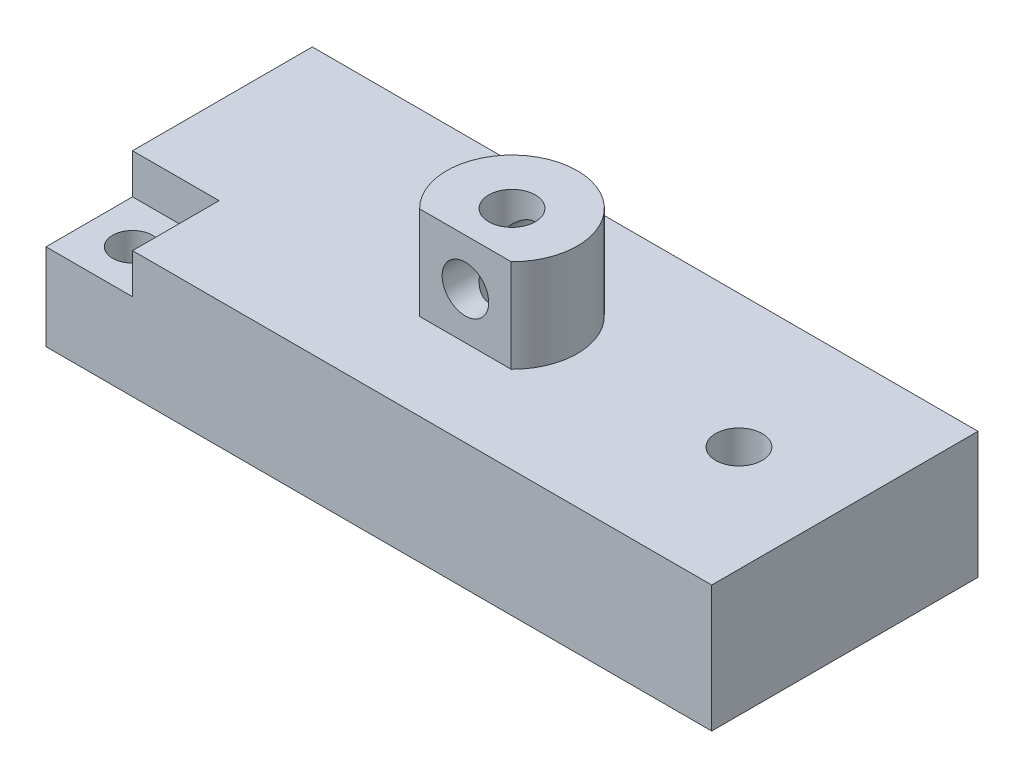
ISO-10303-21;
HEADER;
FILE_DESCRIPTION(('STEP AP214'),'2;1');
FILE_NAME('part.step','',(''),(''),'','','');
FILE_SCHEMA(('AUTOMOTIVE_DESIGN { 1 0 10303 214 1 1 1 1 }'));
ENDSEC;
DATA;
#1=APPLICATION_CONTEXT('core data for automotive mechanical design processes');
#2=APPLICATION_PROTOCOL_DEFINITION('international standard','automotive_design',2000,#1);
#3=PRODUCT_CONTEXT('',#1,'mechanical');
#4=PRODUCT('Part','Part','',(#3));
#5=PRODUCT_RELATED_PRODUCT_CATEGORY('part','',(#4));
#6=PRODUCT_DEFINITION_FORMATION('','',#4);
#7=PRODUCT_DEFINITION_CONTEXT('part definition',#1,'design');
#8=PRODUCT_DEFINITION('design','',#6,#7);
#9=PRODUCT_DEFINITION_SHAPE('','',#8);
#10=(LENGTH_UNIT() NAMED_UNIT(*) SI_UNIT(.MILLI.,.METRE.));
#11=(NAMED_UNIT(*) PLANE_ANGLE_UNIT() SI_UNIT($,.RADIAN.));
#12=(NAMED_UNIT(*) SI_UNIT($,.STERADIAN.) SOLID_ANGLE_UNIT());
#13=UNCERTAINTY_MEASURE_WITH_UNIT(LENGTH_MEASURE(1.E-05),#10,'distance_accuracy_value','');
#14=(GEOMETRIC_REPRESENTATION_CONTEXT(3) GLOBAL_UNCERTAINTY_ASSIGNED_CONTEXT((#13)) GLOBAL_UNIT_ASSIGNED_CONTEXT((#10,
#11,#12)) REPRESENTATION_CONTEXT('',''));
#15=CARTESIAN_POINT('',(0.,0.,0.));
#16=DIRECTION('',(0.,0.,1.));
#17=DIRECTION('',(1.,0.,0.));
#18=AXIS2_PLACEMENT_3D('',#15,#16,#17);
#19=CARTESIAN_POINT('',(-50.,0.,-20.));
#20=DIRECTION('',(0.,1.,0.));
#21=DIRECTION('',(0.,0.,1.));
#22=AXIS2_PLACEMENT_3D('',#19,#20,#21);
#23=CYLINDRICAL_SURFACE('',#22,3.5);
#24=CARTESIAN_POINT('',(-50.,33.,-20.));
#25=DIRECTION('',(0.,1.,0.));
#26=DIRECTION('',(0.,0.,1.));
#27=AXIS2_PLACEMENT_3D('',#24,#25,#26);
#28=CIRCLE('',#27,3.5);
#29=CARTESIAN_POINT('',(-50.,33.,-16.5));
#30=VERTEX_POINT('',#29);
#31=EDGE_CURVE('E191',#30,#30,#28,.T.);
#32=ORIENTED_EDGE('',*,*,#31,.T.);
#33=EDGE_LOOP('',(#32));
#34=FACE_BOUND('',#33,.T.);
#35=CARTESIAN_POINT('',(-50.,26.,-20.));
#36=DIRECTION('',(0.,0.707106781186547,-0.707106781186547));
#37=DIRECTION('',(0.,0.707106781186547,0.707106781186547));
#38=AXIS2_PLACEMENT_3D('',#35,#36,#37);
#39=ELLIPSE('',#38,4.94974746830583,3.5);
#40=CARTESIAN_POINT('',(-46.5,26.,-20.));
#41=VERTEX_POINT('',#40);
#42=CARTESIAN_POINT('',(-53.5,26.,-20.));
#43=VERTEX_POINT('',#42);
#44=EDGE_CURVE('E51',#41,#43,#39,.F.);
#45=ORIENTED_EDGE('',*,*,#44,.T.);
#46=CARTESIAN_POINT('',(-50.,26.,-20.));
#47=DIRECTION('',(0.,0.707106781186547,0.707106781186547));
#48=DIRECTION('',(0.,0.707106781186547,-0.707106781186547));
#49=AXIS2_PLACEMENT_3D('',#46,#47,#48);
#50=ELLIPSE('',#49,4.94974746830583,3.5);
#51=EDGE_CURVE('E117',#43,#41,#50,.F.);
#52=ORIENTED_EDGE('',*,*,#51,.T.);
#53=EDGE_LOOP('',(#45,#52));
#54=FACE_BOUND('',#53,.T.);
#55=ADVANCED_FACE('F37',(#34,#54),#23,.F.);
#56=CARTESIAN_POINT('',(-50.,33.,-20.));
#57=DIRECTION('',(0.,-1.,0.));
#58=DIRECTION('',(0.,0.,-1.));
#59=AXIS2_PLACEMENT_3D('',#56,#57,#58);
#60=CYLINDRICAL_SURFACE('',#59,9.81112486838624);
#61=CARTESIAN_POINT('',(-46.5,26.,-29.1655971536538));
#62=CARTESIAN_POINT('',(-46.4999959575407,26.189753775742,-29.1655936197126));
#63=CARTESIAN_POINT('',(-46.5154831093173,26.379479591417,-29.1715540201519));
#64=CARTESIAN_POINT('',(-46.5767740193726,26.7532553396806,-29.1946043466456));
#65=CARTESIAN_POINT('',(-46.6225793321416,26.9373049807307,-29.2116948433681));
#66=CARTESIAN_POINT('',(-46.7426482580994,27.2942404806911,-29.2548283813791));
#67=CARTESIAN_POINT('',(-46.8168494052689,27.467149877609,-29.2808517589908));
#68=CARTESIAN_POINT('',(-46.9913856630945,27.7981291369507,-29.3388886193589));
#69=CARTESIAN_POINT('',(-47.0917277584798,27.9561950178822,-29.3709037024239));
#70=CARTESIAN_POINT('',(-47.3205232048919,28.2600969952536,-29.4389279168807));
#71=CARTESIAN_POINT('',(-47.4499564341773,28.405171028389,-29.4750467099488));
#72=CARTESIAN_POINT('',(-47.7311754866777,28.6720831940139,-29.5462885523174));
#73=CARTESIAN_POINT('',(-47.8829655086439,28.7939169519424,-29.5814114130943));
#74=CARTESIAN_POINT('',(-48.2102780311591,29.0144638566502,-29.6479921376355));
#75=CARTESIAN_POINT('',(-48.3863814285024,29.1123621580104,-29.6793062432038));
#76=CARTESIAN_POINT('',(-48.7538695133371,29.2768346104,-29.7334349364302));
#77=CARTESIAN_POINT('',(-48.9452494184565,29.343418519889,-29.7562521714939));
#78=CARTESIAN_POINT('',(-49.329855751348,29.4407396020613,-29.7900386064196));
#79=CARTESIAN_POINT('',(-49.5227123198034,29.472785802565,-29.8014392076947));
#80=CARTESIAN_POINT('',(-49.911380199943,29.5043016082939,-29.8126484203655));
#81=CARTESIAN_POINT('',(-50.1071906244993,29.5037808069808,-29.8124604454794));
#82=CARTESIAN_POINT('',(-50.4868784987982,29.4709705189766,-29.8007962459735));
#83=CARTESIAN_POINT('',(-50.6708973261819,29.4401065618152,-29.7898265553725));
#84=CARTESIAN_POINT('',(-51.0309479784759,29.3498656443461,-29.7584830210944));
#85=CARTESIAN_POINT('',(-51.2069792449731,29.2904866938966,-29.738108521033));
#86=CARTESIAN_POINT('',(-51.5489732400456,29.1441642612299,-29.6896401185619));
#87=CARTESIAN_POINT('',(-51.7147603621375,29.0568462637511,-29.6614420688967));
#88=CARTESIAN_POINT('',(-52.0297238228236,28.8574447506488,-29.6002173338307));
#89=CARTESIAN_POINT('',(-52.1788950859986,28.7453536989692,-29.5671891801307));
#90=CARTESIAN_POINT('',(-52.4648325234899,28.4925744973598,-29.497661694568));
#91=CARTESIAN_POINT('',(-52.6005105093808,28.3506786703783,-29.4610711843252));
#92=CARTESIAN_POINT('',(-52.8465292437933,28.0458833876895,-29.3899882733594));
#93=CARTESIAN_POINT('',(-52.9568648153576,27.8829796510727,-29.3554963023827));
#94=CARTESIAN_POINT('',(-53.1508790442164,27.5368854447923,-29.2919741597751));
#95=CARTESIAN_POINT('',(-53.2340297551716,27.3533768035878,-29.263056185623));
#96=CARTESIAN_POINT('',(-53.3678552869617,26.9736629326802,-29.2152499748649));
#97=CARTESIAN_POINT('',(-53.4185461310547,26.7774640200573,-29.1963567904836));
#98=CARTESIAN_POINT('',(-53.4836558322497,26.388603268443,-29.1718846928683));
#99=CARTESIAN_POINT('',(-53.4997853693822,26.1962674739824,-29.1656785820018));
#100=CARTESIAN_POINT('',(-53.5002102335529,25.8115789768244,-29.1655174042651));
#101=CARTESIAN_POINT('',(-53.4845124778404,25.6192262868845,-29.171559675368));
#102=CARTESIAN_POINT('',(-53.4232737215708,25.2482763398421,-29.1945825532922));
#103=CARTESIAN_POINT('',(-53.3789928818688,25.0694391364285,-29.2111007849789));
#104=CARTESIAN_POINT('',(-53.2633970067619,24.7217927513014,-29.252683803535));
#105=CARTESIAN_POINT('',(-53.1920767582699,24.5529855105877,-29.2777502383692));
#106=CARTESIAN_POINT('',(-53.0216018974447,24.2236251601591,-29.3346888715952));
#107=CARTESIAN_POINT('',(-52.9215597406489,24.0635683571309,-29.3667687221105));
#108=CARTESIAN_POINT('',(-52.6974522598166,23.7619012317419,-29.4337469319104));
#109=CARTESIAN_POINT('',(-52.5733788912104,23.6202971131382,-29.4686462327334));
#110=CARTESIAN_POINT('',(-52.2964419909179,23.3512881352012,-29.5397094673707));
#111=CARTESIAN_POINT('',(-52.1423498453662,23.225133574855,-29.5758337996397));
#112=CARTESIAN_POINT('',(-51.8142911384646,23.0003541404858,-29.643366934516));
#113=CARTESIAN_POINT('',(-51.6403249171507,22.9017287955504,-29.6747758177811));
#114=CARTESIAN_POINT('',(-51.2779591182618,22.7355972751288,-29.7292522258762));
#115=CARTESIAN_POINT('',(-51.0896386628378,22.667933124576,-29.7523619627897));
#116=CARTESIAN_POINT('',(-50.7032882578167,22.5655749416342,-29.7878043071646));
#117=CARTESIAN_POINT('',(-50.5052624234106,22.5308670604439,-29.8001414412867));
#118=CARTESIAN_POINT('',(-50.1164812108931,22.4967913605334,-29.8122584503713));
#119=CARTESIAN_POINT('',(-49.9259004200788,22.4956395859983,-29.8126721992475));
#120=CARTESIAN_POINT('',(-49.5473846329555,22.5242048737278,-29.8025070275552));
#121=CARTESIAN_POINT('',(-49.3594493689511,22.5539187896669,-29.7919292274213));
#122=CARTESIAN_POINT('',(-48.9954153642741,22.6421452937033,-29.7612348905884));
#123=CARTESIAN_POINT('',(-48.8191535217861,22.7000591164322,-29.7413169829597));
#124=CARTESIAN_POINT('',(-48.4788076107955,22.8424656830067,-29.6940032023839));
#125=CARTESIAN_POINT('',(-48.3147258304041,22.9269634052881,-29.6666059288838));
#126=CARTESIAN_POINT('',(-47.9962242386715,23.1240060227884,-29.6057482916415));
#127=CARTESIAN_POINT('',(-47.8424534278274,23.237537600056,-29.5720892414755));
#128=CARTESIAN_POINT('',(-47.5555789365927,23.4878160709107,-29.502883330997));
#129=CARTESIAN_POINT('',(-47.4224823416618,23.6245708900943,-29.4673358290518));
#130=CARTESIAN_POINT('',(-47.1743893180206,23.9250042672106,-29.3963574892219));
#131=CARTESIAN_POINT('',(-47.0605241988582,24.0896399487981,-29.3610091481663));
#132=CARTESIAN_POINT('',(-46.8620928142822,24.4368292779223,-29.2963781490224));
#133=CARTESIAN_POINT('',(-46.7775244666391,24.6193816508697,-29.2670950599139));
#134=CARTESIAN_POINT('',(-46.6403981519107,24.9981285557256,-29.2182759795809));
#135=CARTESIAN_POINT('',(-46.5879455919013,25.1943656800472,-29.1987721222516));
#136=CARTESIAN_POINT('',(-46.51775733691,25.5937482124318,-29.172437760984));
#137=CARTESIAN_POINT('',(-46.5000043269938,25.7968901235208,-29.1656009363368));
#138=CARTESIAN_POINT('',(-46.5,26.,-29.1655971536538));
#139=B_SPLINE_CURVE_WITH_KNOTS('',3,(#61,#62,#63,#64,#65,#66,#67,#68,#69,#70,#71,#72,#73,#74,
#75,#76,#77,#78,#79,#80,#81,#82,#83,#84,#85,#86,#87,#88,#89,#90,#91,#92,#93,#94,#95,#96,#97,#98,
#99,#100,#101,#102,#103,#104,#105,#106,#107,#108,#109,#110,#111,#112,#113,#114,#115,#116,#117,
#118,#119,#120,#121,#122,#123,#124,#125,#126,#127,#128,#129,#130,#131,#132,#133,#134,#135,#136,
#137,#138),.UNSPECIFIED.,.T.,.F.,(4,2,2,2,2,2,2,2,2,2,2,2,2,2,2,2,2,2,2,2,2,2,2,2,2,2,2,2,2,2,2,
2,2,2,2,2,2,2,4),(0.,0.56850687041735,1.13704289190895,1.70433535390045,2.271779549309,
2.862374684489,3.45308087904766,4.06173264008762,4.67019460195559,5.25468259406763,
5.83899841077301,6.39711397383288,6.95526849501137,7.52124256876108,8.08738905151482,
8.68377546539236,9.28028360116001,9.887769504378,10.4949553009332,11.0713179496755,
11.6475553469011,12.1999782379598,12.7525076880892,13.3243928215945,13.896469728453,
14.5007932595262,15.1051064524573,15.7063008651034,16.307242533385,16.876174299095,
17.4450480758592,18.0023375521361,18.5597314556443,19.1394208923778,19.7193085637918,
20.3261964619746,20.9330412175453,21.5418671659248,22.1503892349931),.UNSPECIFIED.);
#140=CARTESIAN_POINT('',(-46.5,26.,-29.1655971536538));
#141=VERTEX_POINT('',#140);
#142=EDGE_CURVE('E126',#141,#141,#139,.T.);
#143=ORIENTED_EDGE('',*,*,#142,.T.);
#144=EDGE_LOOP('',(#143));
#145=FACE_BOUND('',#144,.T.);
#146=DIRECTION('',(0.,-1.,0.));
#147=VECTOR('',#146,1.);
#148=CARTESIAN_POINT('',(-56.8744578828492,33.,-13.));
#149=LINE('',#148,#147);
#150=CARTESIAN_POINT('',(-56.8744578828492,33.,-13.));
#151=VERTEX_POINT('',#150);
#152=CARTESIAN_POINT('',(-56.8744578828492,19.,-13.));
#153=VERTEX_POINT('',#152);
#154=EDGE_CURVE('E410',#151,#153,#149,.T.);
#155=ORIENTED_EDGE('',*,*,#154,.F.);
#156=CARTESIAN_POINT('',(-50.,33.,-20.));
#157=DIRECTION('',(0.,1.,0.));
#158=DIRECTION('',(0.,0.,1.));
#159=AXIS2_PLACEMENT_3D('',#156,#157,#158);
#160=CIRCLE('',#159,9.81112486838624);
#161=CARTESIAN_POINT('',(-43.1255421171509,33.,-13.));
#162=VERTEX_POINT('',#161);
#163=EDGE_CURVE('E228',#162,#151,#160,.T.);
#164=ORIENTED_EDGE('',*,*,#163,.F.);
#165=DIRECTION('',(0.,-1.,0.));
#166=VECTOR('',#165,1.);
#167=CARTESIAN_POINT('',(-43.1255421171509,33.,-13.));
#168=LINE('',#167,#166);
#169=CARTESIAN_POINT('',(-43.1255421171509,19.,-13.));
#170=VERTEX_POINT('',#169);
#171=EDGE_CURVE('E59',#170,#162,#168,.F.);
#172=ORIENTED_EDGE('',*,*,#171,.F.);
#173=CARTESIAN_POINT('',(-50.,19.,-20.));
#174=DIRECTION('',(0.,1.,0.));
#175=DIRECTION('',(0.,0.,1.));
#176=AXIS2_PLACEMENT_3D('',#173,#174,#175);
#177=CIRCLE('',#176,9.81112486838624);
#178=EDGE_CURVE('E45',#170,#153,#177,.T.);
#179=ORIENTED_EDGE('',*,*,#178,.T.);
#180=EDGE_LOOP('',(#155,#164,#172,#179));
#181=FACE_BOUND('',#180,.T.);
#182=ADVANCED_FACE('F141',(#145,#181),#60,.T.);
#183=CARTESIAN_POINT('',(-50.,33.,-20.));
#184=DIRECTION('',(0.,1.,0.));
#185=DIRECTION('',(0.,0.,1.));
#186=AXIS2_PLACEMENT_3D('',#183,#184,#185);
#187=PLANE('',#186);
#188=ORIENTED_EDGE('',*,*,#31,.F.);
#189=EDGE_LOOP('',(#188));
#190=FACE_BOUND('',#189,.T.);
#191=ORIENTED_EDGE('',*,*,#163,.T.);
#192=DIRECTION('',(1.,0.,0.));
#193=VECTOR('',#192,1.);
#194=CARTESIAN_POINT('',(-50.,33.,-13.));
#195=LINE('',#194,#193);
#196=EDGE_CURVE('E11',#151,#162,#195,.T.);
#197=ORIENTED_EDGE('',*,*,#196,.T.);
#198=EDGE_LOOP('',(#191,#197));
#199=FACE_BOUND('',#198,.T.);
#200=ADVANCED_FACE('F174',(#190,#199),#187,.T.);
#201=CARTESIAN_POINT('',(0.,19.,0.));
#202=DIRECTION('',(-1.,0.,0.));
#203=DIRECTION('',(0.,0.,1.));
#204=AXIS2_PLACEMENT_3D('',#201,#202,#203);
#205=PLANE('',#204);
#206=DIRECTION('',(0.,0.,-1.));
#207=VECTOR('',#206,1.);
#208=CARTESIAN_POINT('',(0.,0.,0.));
#209=LINE('',#208,#207);
#210=CARTESIAN_POINT('',(0.,0.,0.));
#211=VERTEX_POINT('',#210);
#212=CARTESIAN_POINT('',(0.,0.,-40.));
#213=VERTEX_POINT('',#212);
#214=EDGE_CURVE('E234',#211,#213,#209,.T.);
#215=ORIENTED_EDGE('',*,*,#214,.T.);
#216=DIRECTION('',(0.,-1.,0.));
#217=VECTOR('',#216,1.);
#218=CARTESIAN_POINT('',(0.,19.,-40.));
#219=LINE('',#218,#217);
#220=CARTESIAN_POINT('',(0.,19.,-40.));
#221=VERTEX_POINT('',#220);
#222=EDGE_CURVE('E237',#221,#213,#219,.T.);
#223=ORIENTED_EDGE('',*,*,#222,.F.);
#224=DIRECTION('',(0.,0.,-1.));
#225=VECTOR('',#224,1.);
#226=CARTESIAN_POINT('',(0.,19.,0.));
#227=LINE('',#226,#225);
#228=CARTESIAN_POINT('',(0.,19.,0.));
#229=VERTEX_POINT('',#228);
#230=EDGE_CURVE('E238',#229,#221,#227,.T.);
#231=ORIENTED_EDGE('',*,*,#230,.F.);
#232=DIRECTION('',(0.,-1.,0.));
#233=VECTOR('',#232,1.);
#234=CARTESIAN_POINT('',(0.,19.,0.));
#235=LINE('',#234,#233);
#236=EDGE_CURVE('E248',#229,#211,#235,.T.);
#237=ORIENTED_EDGE('',*,*,#236,.T.);
#238=EDGE_LOOP('',(#215,#223,#231,#237));
#239=FACE_BOUND('',#238,.T.);
#240=ADVANCED_FACE('F39',(#239),#205,.F.);
#241=CARTESIAN_POINT('',(0.,19.,-40.));
#242=DIRECTION('',(0.,0.,1.));
#243=DIRECTION('',(1.,0.,0.));
#244=AXIS2_PLACEMENT_3D('',#241,#242,#243);
#245=PLANE('',#244);
#246=DIRECTION('',(-1.,0.,0.));
#247=VECTOR('',#246,1.);
#248=CARTESIAN_POINT('',(0.,0.,-40.));
#249=LINE('',#248,#247);
#250=CARTESIAN_POINT('',(-100.,0.,-40.));
#251=VERTEX_POINT('',#250);
#252=EDGE_CURVE('E251',#213,#251,#249,.T.);
#253=ORIENTED_EDGE('',*,*,#252,.T.);
#254=DIRECTION('',(0.,-1.,0.));
#255=VECTOR('',#254,1.);
#256=CARTESIAN_POINT('',(-100.,19.,-40.));
#257=LINE('',#256,#255);
#258=CARTESIAN_POINT('',(-100.,19.,-40.));
#259=VERTEX_POINT('',#258);
#260=EDGE_CURVE('E261',#259,#251,#257,.T.);
#261=ORIENTED_EDGE('',*,*,#260,.F.);
#262=DIRECTION('',(-1.,0.,0.));
#263=VECTOR('',#262,1.);
#264=CARTESIAN_POINT('',(0.,19.,-40.));
#265=LINE('',#264,#263);
#266=EDGE_CURVE('E240',#221,#259,#265,.T.);
#267=ORIENTED_EDGE('',*,*,#266,.F.);
#268=ORIENTED_EDGE('',*,*,#222,.T.);
#269=EDGE_LOOP('',(#253,#261,#267,#268));
#270=FACE_BOUND('',#269,.T.);
#271=ADVANCED_FACE('F181',(#270),#245,.F.);
#272=CARTESIAN_POINT('',(-100.,19.,0.));
#273=DIRECTION('',(1.,0.,0.));
#274=DIRECTION('',(0.,0.,-1.));
#275=AXIS2_PLACEMENT_3D('',#272,#273,#274);
#276=PLANE('',#275);
#277=DIRECTION('',(0.,0.,1.));
#278=VECTOR('',#277,1.);
#279=CARTESIAN_POINT('',(-100.,13.,-13.));
#280=LINE('',#279,#278);
#281=CARTESIAN_POINT('',(-100.,13.,-13.));
#282=VERTEX_POINT('',#281);
#283=CARTESIAN_POINT('',(-100.,13.,0.));
#284=VERTEX_POINT('',#283);
#285=EDGE_CURVE('E209',#282,#284,#280,.T.);
#286=ORIENTED_EDGE('',*,*,#285,.F.);
#287=DIRECTION('',(0.,1.,0.));
#288=VECTOR('',#287,1.);
#289=CARTESIAN_POINT('',(-100.,13.,-13.));
#290=LINE('',#289,#288);
#291=CARTESIAN_POINT('',(-100.,19.,-13.));
#292=VERTEX_POINT('',#291);
#293=EDGE_CURVE('E225',#282,#292,#290,.T.);
#294=ORIENTED_EDGE('',*,*,#293,.T.);
#295=DIRECTION('',(0.,0.,1.));
#296=VECTOR('',#295,1.);
#297=CARTESIAN_POINT('',(-100.,19.,0.));
#298=LINE('',#297,#296);
#299=EDGE_CURVE('E243',#259,#292,#298,.T.);
#300=ORIENTED_EDGE('',*,*,#299,.F.);
#301=ORIENTED_EDGE('',*,*,#260,.T.);
#302=DIRECTION('',(0.,0.,1.));
#303=VECTOR('',#302,1.);
#304=CARTESIAN_POINT('',(-100.,0.,0.));
#305=LINE('',#304,#303);
#306=CARTESIAN_POINT('',(-100.,0.,0.));
#307=VERTEX_POINT('',#306);
#308=EDGE_CURVE('E253',#251,#307,#305,.T.);
#309=ORIENTED_EDGE('',*,*,#308,.T.);
#310=DIRECTION('',(0.,-1.,0.));
#311=VECTOR('',#310,1.);
#312=CARTESIAN_POINT('',(-100.,19.,0.));
#313=LINE('',#312,#311);
#314=EDGE_CURVE('E259',#284,#307,#313,.T.);
#315=ORIENTED_EDGE('',*,*,#314,.F.);
#316=EDGE_LOOP('',(#286,#294,#300,#301,#309,#315));
#317=FACE_BOUND('',#316,.T.);
#318=ADVANCED_FACE('F277',(#317),#276,.F.);
#319=CARTESIAN_POINT('',(0.,19.,0.));
#320=DIRECTION('',(0.,0.,-1.));
#321=DIRECTION('',(-1.,0.,0.));
#322=AXIS2_PLACEMENT_3D('',#319,#320,#321);
#323=PLANE('',#322);
#324=DIRECTION('',(1.,0.,0.));
#325=VECTOR('',#324,1.);
#326=CARTESIAN_POINT('',(0.,19.,0.));
#327=LINE('',#326,#325);
#328=CARTESIAN_POINT('',(-87.,19.,0.));
#329=VERTEX_POINT('',#328);
#330=EDGE_CURVE('E246',#329,#229,#327,.T.);
#331=ORIENTED_EDGE('',*,*,#330,.F.);
#332=DIRECTION('',(0.,1.,0.));
#333=VECTOR('',#332,1.);
#334=CARTESIAN_POINT('',(-87.,13.,0.));
#335=LINE('',#334,#333);
#336=CARTESIAN_POINT('',(-87.,13.,0.));
#337=VERTEX_POINT('',#336);
#338=EDGE_CURVE('E221',#337,#329,#335,.T.);
#339=ORIENTED_EDGE('',*,*,#338,.F.);
#340=DIRECTION('',(1.,0.,0.));
#341=VECTOR('',#340,1.);
#342=CARTESIAN_POINT('',(-100.,13.,0.));
#343=LINE('',#342,#341);
#344=EDGE_CURVE('E211',#284,#337,#343,.T.);
#345=ORIENTED_EDGE('',*,*,#344,.F.);
#346=ORIENTED_EDGE('',*,*,#314,.T.);
#347=DIRECTION('',(1.,0.,0.));
#348=VECTOR('',#347,1.);
#349=CARTESIAN_POINT('',(0.,0.,0.));
#350=LINE('',#349,#348);
#351=EDGE_CURVE('E241',#307,#211,#350,.T.);
#352=ORIENTED_EDGE('',*,*,#351,.T.);
#353=ORIENTED_EDGE('',*,*,#236,.F.);
#354=EDGE_LOOP('',(#331,#339,#345,#346,#352,#353));
#355=FACE_BOUND('',#354,.T.);
#356=ADVANCED_FACE('F287',(#355),#323,.F.);
#357=CARTESIAN_POINT('',(0.,19.,0.));
#358=DIRECTION('',(0.,1.,0.));
#359=DIRECTION('',(0.,0.,1.));
#360=AXIS2_PLACEMENT_3D('',#357,#358,#359);
#361=PLANE('',#360);
#362=DIRECTION('',(-1.,0.,0.));
#363=VECTOR('',#362,1.);
#364=CARTESIAN_POINT('',(-87.,19.,-13.));
#365=LINE('',#364,#363);
#366=EDGE_CURVE('E139',#170,#153,#365,.T.);
#367=ORIENTED_EDGE('',*,*,#366,.T.);
#368=ORIENTED_EDGE('',*,*,#178,.F.);
#369=EDGE_LOOP('',(#367,#368));
#370=FACE_BOUND('',#369,.T.);
#371=DIRECTION('',(-1.,0.,0.));
#372=VECTOR('',#371,1.);
#373=CARTESIAN_POINT('',(-100.,19.,-13.));
#374=LINE('',#373,#372);
#375=CARTESIAN_POINT('',(-87.,19.,-13.));
#376=VERTEX_POINT('',#375);
#377=EDGE_CURVE('E212',#376,#292,#374,.T.);
#378=ORIENTED_EDGE('',*,*,#377,.F.);
#379=DIRECTION('',(0.,0.,-1.));
#380=VECTOR('',#379,1.);
#381=CARTESIAN_POINT('',(-87.,19.,-13.));
#382=LINE('',#381,#380);
#383=EDGE_CURVE('E206',#329,#376,#382,.T.);
#384=ORIENTED_EDGE('',*,*,#383,.F.);
#385=ORIENTED_EDGE('',*,*,#330,.T.);
#386=ORIENTED_EDGE('',*,*,#230,.T.);
#387=ORIENTED_EDGE('',*,*,#266,.T.);
#388=ORIENTED_EDGE('',*,*,#299,.T.);
#389=EDGE_LOOP('',(#378,#384,#385,#386,#387,#388));
#390=FACE_BOUND('',#389,.T.);
#391=CARTESIAN_POINT('',(-15.9108982396106,19.,-20.));
#392=DIRECTION('',(0.,1.,0.));
#393=DIRECTION('',(0.,0.,1.));
#394=AXIS2_PLACEMENT_3D('',#391,#392,#393);
#395=CIRCLE('',#394,3.5);
#396=CARTESIAN_POINT('',(-15.9108982396106,19.,-16.5));
#397=VERTEX_POINT('',#396);
#398=EDGE_CURVE('E199',#397,#397,#395,.T.);
#399=ORIENTED_EDGE('',*,*,#398,.F.);
#400=EDGE_LOOP('',(#399));
#401=FACE_BOUND('',#400,.T.);
#402=ADVANCED_FACE('F281',(#370,#390,#401),#361,.T.);
#403=CARTESIAN_POINT('',(0.,0.,0.));
#404=DIRECTION('',(0.,1.,0.));
#405=DIRECTION('',(0.,0.,1.));
#406=AXIS2_PLACEMENT_3D('',#403,#404,#405);
#407=PLANE('',#406);
#408=CARTESIAN_POINT('',(-15.9108982396106,0.,-20.));
#409=DIRECTION('',(0.,1.,0.));
#410=DIRECTION('',(0.,0.,1.));
#411=AXIS2_PLACEMENT_3D('',#408,#409,#410);
#412=CIRCLE('',#411,3.5);
#413=CARTESIAN_POINT('',(-15.9108982396106,0.,-16.5));
#414=VERTEX_POINT('',#413);
#415=EDGE_CURVE('E193',#414,#414,#412,.T.);
#416=ORIENTED_EDGE('',*,*,#415,.T.);
#417=EDGE_LOOP('',(#416));
#418=FACE_BOUND('',#417,.T.);
#419=CARTESIAN_POINT('',(-50.,0.,-20.));
#420=DIRECTION('',(0.,1.,0.));
#421=DIRECTION('',(0.,0.,1.));
#422=AXIS2_PLACEMENT_3D('',#419,#420,#421);
#423=CIRCLE('',#422,3.5);
#424=CARTESIAN_POINT('',(-50.,0.,-16.5));
#425=VERTEX_POINT('',#424);
#426=EDGE_CURVE('E192',#425,#425,#423,.T.);
#427=ORIENTED_EDGE('',*,*,#426,.T.);
#428=EDGE_LOOP('',(#427));
#429=FACE_BOUND('',#428,.T.);
#430=CARTESIAN_POINT('',(-93.5,0.,-6.5));
#431=DIRECTION('',(0.,1.,0.));
#432=DIRECTION('',(0.,0.,1.));
#433=AXIS2_PLACEMENT_3D('',#430,#431,#432);
#434=CIRCLE('',#433,3.00000000000001);
#435=CARTESIAN_POINT('',(-93.5,0.,-3.49999999999999));
#436=VERTEX_POINT('',#435);
#437=EDGE_CURVE('E203',#436,#436,#434,.T.);
#438=ORIENTED_EDGE('',*,*,#437,.T.);
#439=EDGE_LOOP('',(#438));
#440=FACE_BOUND('',#439,.T.);
#441=ORIENTED_EDGE('',*,*,#214,.F.);
#442=ORIENTED_EDGE('',*,*,#351,.F.);
#443=ORIENTED_EDGE('',*,*,#308,.F.);
#444=ORIENTED_EDGE('',*,*,#252,.F.);
#445=EDGE_LOOP('',(#441,#442,#443,#444));
#446=FACE_BOUND('',#445,.T.);
#447=ADVANCED_FACE('F170',(#418,#429,#440,#446),#407,.F.);
#448=CARTESIAN_POINT('',(-100.,13.,-13.));
#449=DIRECTION('',(0.,0.,-1.));
#450=DIRECTION('',(-1.,0.,0.));
#451=AXIS2_PLACEMENT_3D('',#448,#449,#450);
#452=PLANE('',#451);
#453=ORIENTED_EDGE('',*,*,#377,.T.);
#454=ORIENTED_EDGE('',*,*,#293,.F.);
#455=DIRECTION('',(-1.,0.,0.));
#456=VECTOR('',#455,1.);
#457=CARTESIAN_POINT('',(-100.,13.,-13.));
#458=LINE('',#457,#456);
#459=CARTESIAN_POINT('',(-87.,13.,-13.));
#460=VERTEX_POINT('',#459);
#461=EDGE_CURVE('E218',#460,#282,#458,.T.);
#462=ORIENTED_EDGE('',*,*,#461,.F.);
#463=DIRECTION('',(0.,1.,0.));
#464=VECTOR('',#463,1.);
#465=CARTESIAN_POINT('',(-87.,13.,-13.));
#466=LINE('',#465,#464);
#467=EDGE_CURVE('E229',#460,#376,#466,.T.);
#468=ORIENTED_EDGE('',*,*,#467,.T.);
#469=EDGE_LOOP('',(#453,#454,#462,#468));
#470=FACE_BOUND('',#469,.T.);
#471=ADVANCED_FACE('F167',(#470),#452,.F.);
#472=CARTESIAN_POINT('',(-87.,13.,-13.));
#473=DIRECTION('',(1.,0.,0.));
#474=DIRECTION('',(0.,0.,-1.));
#475=AXIS2_PLACEMENT_3D('',#472,#473,#474);
#476=PLANE('',#475);
#477=ORIENTED_EDGE('',*,*,#383,.T.);
#478=ORIENTED_EDGE('',*,*,#467,.F.);
#479=DIRECTION('',(0.,0.,-1.));
#480=VECTOR('',#479,1.);
#481=CARTESIAN_POINT('',(-87.,13.,-13.));
#482=LINE('',#481,#480);
#483=EDGE_CURVE('E215',#337,#460,#482,.T.);
#484=ORIENTED_EDGE('',*,*,#483,.F.);
#485=ORIENTED_EDGE('',*,*,#338,.T.);
#486=EDGE_LOOP('',(#477,#478,#484,#485));
#487=FACE_BOUND('',#486,.T.);
#488=ADVANCED_FACE('F165',(#487),#476,.F.);
#489=CARTESIAN_POINT('',(0.,13.,0.));
#490=DIRECTION('',(0.,1.,0.));
#491=DIRECTION('',(0.,0.,1.));
#492=AXIS2_PLACEMENT_3D('',#489,#490,#491);
#493=PLANE('',#492);
#494=CARTESIAN_POINT('',(-93.5,13.,-6.5));
#495=DIRECTION('',(0.,1.,0.));
#496=DIRECTION('',(0.,0.,1.));
#497=AXIS2_PLACEMENT_3D('',#494,#495,#496);
#498=CIRCLE('',#497,3.00000000000001);
#499=CARTESIAN_POINT('',(-93.5,13.,-3.49999999999999));
#500=VERTEX_POINT('',#499);
#501=EDGE_CURVE('E196',#500,#500,#498,.T.);
#502=ORIENTED_EDGE('',*,*,#501,.F.);
#503=EDGE_LOOP('',(#502));
#504=FACE_BOUND('',#503,.T.);
#505=ORIENTED_EDGE('',*,*,#285,.T.);
#506=ORIENTED_EDGE('',*,*,#344,.T.);
#507=ORIENTED_EDGE('',*,*,#483,.T.);
#508=ORIENTED_EDGE('',*,*,#461,.T.);
#509=EDGE_LOOP('',(#505,#506,#507,#508));
#510=FACE_BOUND('',#509,.T.);
#511=ADVANCED_FACE('F161',(#504,#510),#493,.T.);
#512=CARTESIAN_POINT('',(-93.5,0.,-6.5));
#513=DIRECTION('',(0.,1.,0.));
#514=DIRECTION('',(0.,0.,1.));
#515=AXIS2_PLACEMENT_3D('',#512,#513,#514);
#516=CYLINDRICAL_SURFACE('',#515,3.00000000000001);
#517=ORIENTED_EDGE('',*,*,#437,.F.);
#518=EDGE_LOOP('',(#517));
#519=FACE_BOUND('',#518,.T.);
#520=ORIENTED_EDGE('',*,*,#501,.T.);
#521=EDGE_LOOP('',(#520));
#522=FACE_BOUND('',#521,.T.);
#523=ADVANCED_FACE('F158',(#519,#522),#516,.F.);
#524=CARTESIAN_POINT('',(-50.,26.,-20.));
#525=DIRECTION('',(0.,0.707106781186547,-0.707106781186547));
#526=DIRECTION('',(0.,0.707106781186547,0.707106781186547));
#527=AXIS2_PLACEMENT_3D('',#524,#525,#526);
#528=ELLIPSE('',#527,4.94974746830583,3.5);
#529=EDGE_CURVE('E114',#41,#43,#528,.T.);
#530=ORIENTED_EDGE('',*,*,#529,.T.);
#531=CARTESIAN_POINT('',(-50.,26.,-20.));
#532=DIRECTION('',(0.,0.707106781186547,0.707106781186547));
#533=DIRECTION('',(0.,0.707106781186547,-0.707106781186547));
#534=AXIS2_PLACEMENT_3D('',#531,#532,#533);
#535=ELLIPSE('',#534,4.94974746830583,3.5);
#536=EDGE_CURVE('E120',#43,#41,#535,.T.);
#537=ORIENTED_EDGE('',*,*,#536,.T.);
#538=EDGE_LOOP('',(#530,#537));
#539=FACE_BOUND('',#538,.T.);
#540=ORIENTED_EDGE('',*,*,#426,.F.);
#541=EDGE_LOOP('',(#540));
#542=FACE_BOUND('',#541,.T.);
#543=ADVANCED_FACE('F128',(#539,#542),#23,.F.);
#544=CARTESIAN_POINT('',(-15.9108982396106,0.,-20.));
#545=DIRECTION('',(0.,1.,0.));
#546=DIRECTION('',(0.,0.,1.));
#547=AXIS2_PLACEMENT_3D('',#544,#545,#546);
#548=CYLINDRICAL_SURFACE('',#547,3.5);
#549=ORIENTED_EDGE('',*,*,#415,.F.);
#550=EDGE_LOOP('',(#549));
#551=FACE_BOUND('',#550,.T.);
#552=ORIENTED_EDGE('',*,*,#398,.T.);
#553=EDGE_LOOP('',(#552));
#554=FACE_BOUND('',#553,.T.);
#555=ADVANCED_FACE('F151',(#551,#554),#548,.F.);
#556=CARTESIAN_POINT('',(-87.,50.,-13.));
#557=DIRECTION('',(0.,0.,1.));
#558=DIRECTION('',(1.,0.,0.));
#559=AXIS2_PLACEMENT_3D('',#556,#557,#558);
#560=PLANE('',#559);
#561=CARTESIAN_POINT('',(-50.,26.,-13.));
#562=DIRECTION('',(0.,0.,1.));
#563=DIRECTION('',(1.,0.,0.));
#564=AXIS2_PLACEMENT_3D('',#561,#562,#563);
#565=CIRCLE('',#564,3.5);
#566=CARTESIAN_POINT('',(-46.5,26.,-13.));
#567=VERTEX_POINT('',#566);
#568=EDGE_CURVE('E124',#567,#567,#565,.T.);
#569=ORIENTED_EDGE('',*,*,#568,.F.);
#570=EDGE_LOOP('',(#569));
#571=FACE_BOUND('',#570,.T.);
#572=ORIENTED_EDGE('',*,*,#154,.T.);
#573=ORIENTED_EDGE('',*,*,#366,.F.);
#574=ORIENTED_EDGE('',*,*,#171,.T.);
#575=ORIENTED_EDGE('',*,*,#196,.F.);
#576=EDGE_LOOP('',(#572,#573,#574,#575));
#577=FACE_BOUND('',#576,.T.);
#578=ADVANCED_FACE('F148',(#571,#577),#560,.T.);
#579=CARTESIAN_POINT('',(-50.,26.,-40.));
#580=DIRECTION('',(0.,0.,1.));
#581=DIRECTION('',(1.,0.,0.));
#582=AXIS2_PLACEMENT_3D('',#579,#580,#581);
#583=CYLINDRICAL_SURFACE('',#582,3.5);
#584=ORIENTED_EDGE('',*,*,#568,.T.);
#585=EDGE_LOOP('',(#584));
#586=FACE_BOUND('',#585,.T.);
#587=ORIENTED_EDGE('',*,*,#44,.F.);
#588=ORIENTED_EDGE('',*,*,#536,.F.);
#589=EDGE_LOOP('',(#587,#588));
#590=FACE_BOUND('',#589,.T.);
#591=ADVANCED_FACE('F123',(#586,#590),#583,.F.);
#592=ORIENTED_EDGE('',*,*,#529,.F.);
#593=ORIENTED_EDGE('',*,*,#51,.F.);
#594=EDGE_LOOP('',(#592,#593));
#595=FACE_BOUND('',#594,.T.);
#596=ORIENTED_EDGE('',*,*,#142,.F.);
#597=EDGE_LOOP('',(#596));
#598=FACE_BOUND('',#597,.T.);
#599=ADVANCED_FACE('F115',(#595,#598),#583,.F.);
#600=CLOSED_SHELL('',(#55,#182,#200,#240,#271,#318,#356,#402,#447,#471,#488,#511,#523,#543,#555,
#578,#591,#599));
#601=MANIFOLD_SOLID_BREP('B2',#600);
#602=ADVANCED_BREP_SHAPE_REPRESENTATION('',(#18,#601),#14);
#603=SHAPE_DEFINITION_REPRESENTATION(#9,#602);
ENDSEC;
END-ISO-10303-21;
